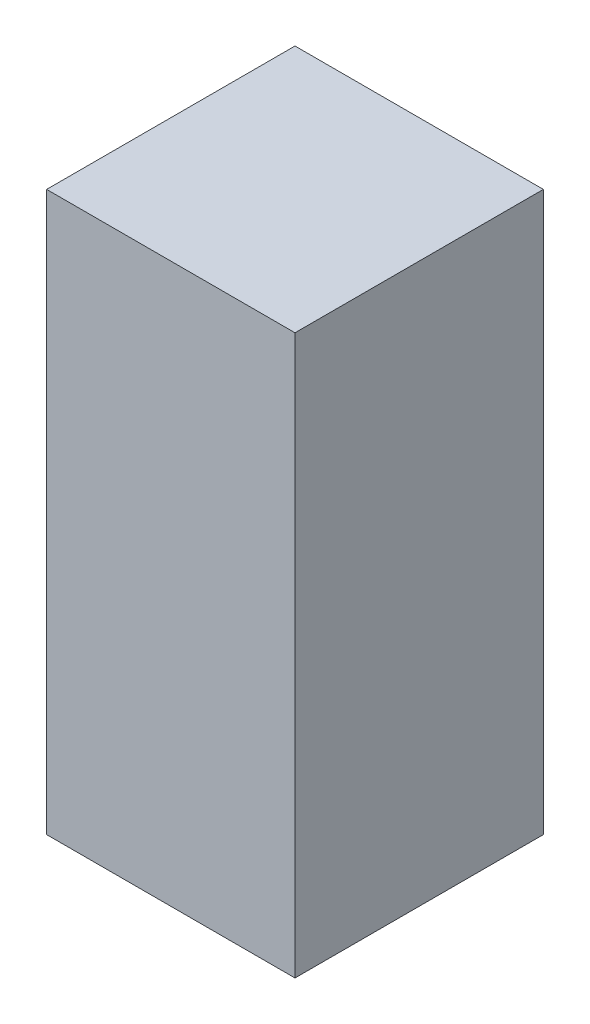
ISO-10303-21;
HEADER;
FILE_DESCRIPTION(('STEP AP214'),'2;1');
FILE_NAME('part.step','',(''),(''),'','','');
FILE_SCHEMA(('AUTOMOTIVE_DESIGN { 1 0 10303 214 1 1 1 1 }'));
ENDSEC;
DATA;
#1=APPLICATION_CONTEXT('core data for automotive mechanical design processes');
#2=APPLICATION_PROTOCOL_DEFINITION('international standard','automotive_design',2000,#1);
#3=PRODUCT_CONTEXT('',#1,'mechanical');
#4=PRODUCT('Part','Part','',(#3));
#5=PRODUCT_RELATED_PRODUCT_CATEGORY('part','',(#4));
#6=PRODUCT_DEFINITION_FORMATION('','',#4);
#7=PRODUCT_DEFINITION_CONTEXT('part definition',#1,'design');
#8=PRODUCT_DEFINITION('design','',#6,#7);
#9=PRODUCT_DEFINITION_SHAPE('','',#8);
#10=(LENGTH_UNIT() NAMED_UNIT(*) SI_UNIT(.MILLI.,.METRE.));
#11=(NAMED_UNIT(*) PLANE_ANGLE_UNIT() SI_UNIT($,.RADIAN.));
#12=(NAMED_UNIT(*) SI_UNIT($,.STERADIAN.) SOLID_ANGLE_UNIT());
#13=UNCERTAINTY_MEASURE_WITH_UNIT(LENGTH_MEASURE(1.E-05),#10,'distance_accuracy_value','');
#14=(GEOMETRIC_REPRESENTATION_CONTEXT(3) GLOBAL_UNCERTAINTY_ASSIGNED_CONTEXT((#13)) GLOBAL_UNIT_ASSIGNED_CONTEXT((#10,
#11,#12)) REPRESENTATION_CONTEXT('',''));
#15=CARTESIAN_POINT('',(0.,0.,0.));
#16=DIRECTION('',(0.,0.,1.));
#17=DIRECTION('',(1.,0.,0.));
#18=AXIS2_PLACEMENT_3D('',#15,#16,#17);
#19=CARTESIAN_POINT('',(177.5,552.,-247.5));
#20=DIRECTION('',(-1.,0.,0.));
#21=DIRECTION('',(0.,0.,1.));
#22=AXIS2_PLACEMENT_3D('',#19,#20,#21);
#23=PLANE('',#22);
#24=DIRECTION('',(0.,-1.,0.));
#25=VECTOR('',#24,1.);
#26=CARTESIAN_POINT('',(177.5,552.,-227.5));
#27=LINE('',#26,#25);
#28=CARTESIAN_POINT('',(177.5,597.,-227.5));
#29=VERTEX_POINT('',#28);
#30=CARTESIAN_POINT('',(177.5,552.,-227.5));
#31=VERTEX_POINT('',#30);
#32=EDGE_CURVE('E103',#29,#31,#27,.T.);
#33=ORIENTED_EDGE('',*,*,#32,.F.);
#34=DIRECTION('',(0.,0.,1.));
#35=VECTOR('',#34,1.);
#36=CARTESIAN_POINT('',(177.5,597.,-247.5));
#37=LINE('',#36,#35);
#38=CARTESIAN_POINT('',(177.5,597.,-247.5));
#39=VERTEX_POINT('',#38);
#40=EDGE_CURVE('E11',#39,#29,#37,.T.);
#41=ORIENTED_EDGE('',*,*,#40,.F.);
#42=DIRECTION('',(0.,-1.,0.));
#43=VECTOR('',#42,1.);
#44=CARTESIAN_POINT('',(177.5,552.,-247.5));
#45=LINE('',#44,#43);
#46=CARTESIAN_POINT('',(177.5,552.,-247.5));
#47=VERTEX_POINT('',#46);
#48=EDGE_CURVE('E97',#39,#47,#45,.T.);
#49=ORIENTED_EDGE('',*,*,#48,.T.);
#50=DIRECTION('',(0.,0.,1.));
#51=VECTOR('',#50,1.);
#52=CARTESIAN_POINT('',(177.5,552.,-247.5));
#53=LINE('',#52,#51);
#54=EDGE_CURVE('E42',#47,#31,#53,.T.);
#55=ORIENTED_EDGE('',*,*,#54,.T.);
#56=EDGE_LOOP('',(#33,#41,#49,#55));
#57=FACE_BOUND('',#56,.T.);
#58=ADVANCED_FACE('F39',(#57),#23,.T.);
#59=CARTESIAN_POINT('',(177.5,597.,-247.5));
#60=DIRECTION('',(0.,1.,0.));
#61=DIRECTION('',(0.,0.,1.));
#62=AXIS2_PLACEMENT_3D('',#59,#60,#61);
#63=PLANE('',#62);
#64=DIRECTION('',(-1.,0.,0.));
#65=VECTOR('',#64,1.);
#66=CARTESIAN_POINT('',(177.5,597.,-227.5));
#67=LINE('',#66,#65);
#68=CARTESIAN_POINT('',(197.5,597.,-227.5));
#69=VERTEX_POINT('',#68);
#70=EDGE_CURVE('E99',#69,#29,#67,.T.);
#71=ORIENTED_EDGE('',*,*,#70,.F.);
#72=DIRECTION('',(0.,0.,1.));
#73=VECTOR('',#72,1.);
#74=CARTESIAN_POINT('',(197.5,597.,-247.5));
#75=LINE('',#74,#73);
#76=CARTESIAN_POINT('',(197.5,597.,-247.5));
#77=VERTEX_POINT('',#76);
#78=EDGE_CURVE('E48',#77,#69,#75,.T.);
#79=ORIENTED_EDGE('',*,*,#78,.F.);
#80=DIRECTION('',(-1.,0.,0.));
#81=VECTOR('',#80,1.);
#82=CARTESIAN_POINT('',(177.5,597.,-247.5));
#83=LINE('',#82,#81);
#84=EDGE_CURVE('E94',#77,#39,#83,.T.);
#85=ORIENTED_EDGE('',*,*,#84,.T.);
#86=ORIENTED_EDGE('',*,*,#40,.T.);
#87=EDGE_LOOP('',(#71,#79,#85,#86));
#88=FACE_BOUND('',#87,.T.);
#89=ADVANCED_FACE('F113',(#88),#63,.T.);
#90=CARTESIAN_POINT('',(197.5,552.,-247.5));
#91=DIRECTION('',(1.,0.,0.));
#92=DIRECTION('',(0.,0.,-1.));
#93=AXIS2_PLACEMENT_3D('',#90,#91,#92);
#94=PLANE('',#93);
#95=DIRECTION('',(0.,1.,0.));
#96=VECTOR('',#95,1.);
#97=CARTESIAN_POINT('',(197.5,552.,-227.5));
#98=LINE('',#97,#96);
#99=CARTESIAN_POINT('',(197.5,552.,-227.5));
#100=VERTEX_POINT('',#99);
#101=EDGE_CURVE('E89',#100,#69,#98,.T.);
#102=ORIENTED_EDGE('',*,*,#101,.F.);
#103=DIRECTION('',(0.,0.,1.));
#104=VECTOR('',#103,1.);
#105=CARTESIAN_POINT('',(197.5,552.,-247.5));
#106=LINE('',#105,#104);
#107=CARTESIAN_POINT('',(197.5,552.,-247.5));
#108=VERTEX_POINT('',#107);
#109=EDGE_CURVE('E84',#108,#100,#106,.T.);
#110=ORIENTED_EDGE('',*,*,#109,.F.);
#111=DIRECTION('',(0.,1.,0.));
#112=VECTOR('',#111,1.);
#113=CARTESIAN_POINT('',(197.5,552.,-247.5));
#114=LINE('',#113,#112);
#115=EDGE_CURVE('E87',#108,#77,#114,.T.);
#116=ORIENTED_EDGE('',*,*,#115,.T.);
#117=ORIENTED_EDGE('',*,*,#78,.T.);
#118=EDGE_LOOP('',(#102,#110,#116,#117));
#119=FACE_BOUND('',#118,.T.);
#120=ADVANCED_FACE('F86',(#119),#94,.T.);
#121=CARTESIAN_POINT('',(177.5,552.,-247.5));
#122=DIRECTION('',(0.,-1.,0.));
#123=DIRECTION('',(0.,0.,-1.));
#124=AXIS2_PLACEMENT_3D('',#121,#122,#123);
#125=PLANE('',#124);
#126=DIRECTION('',(1.,0.,0.));
#127=VECTOR('',#126,1.);
#128=CARTESIAN_POINT('',(177.5,552.,-227.5));
#129=LINE('',#128,#127);
#130=EDGE_CURVE('E106',#31,#100,#129,.T.);
#131=ORIENTED_EDGE('',*,*,#130,.F.);
#132=ORIENTED_EDGE('',*,*,#54,.F.);
#133=DIRECTION('',(1.,0.,0.));
#134=VECTOR('',#133,1.);
#135=CARTESIAN_POINT('',(177.5,552.,-247.5));
#136=LINE('',#135,#134);
#137=EDGE_CURVE('E93',#47,#108,#136,.T.);
#138=ORIENTED_EDGE('',*,*,#137,.T.);
#139=ORIENTED_EDGE('',*,*,#109,.T.);
#140=EDGE_LOOP('',(#131,#132,#138,#139));
#141=FACE_BOUND('',#140,.T.);
#142=ADVANCED_FACE('F96',(#141),#125,.T.);
#143=CARTESIAN_POINT('',(0.,0.,-247.5));
#144=DIRECTION('',(0.,0.,-1.));
#145=DIRECTION('',(-1.,0.,0.));
#146=AXIS2_PLACEMENT_3D('',#143,#144,#145);
#147=PLANE('',#146);
#148=ORIENTED_EDGE('',*,*,#48,.F.);
#149=ORIENTED_EDGE('',*,*,#84,.F.);
#150=ORIENTED_EDGE('',*,*,#115,.F.);
#151=ORIENTED_EDGE('',*,*,#137,.F.);
#152=EDGE_LOOP('',(#148,#149,#150,#151));
#153=FACE_BOUND('',#152,.T.);
#154=ADVANCED_FACE('F92',(#153),#147,.T.);
#155=CARTESIAN_POINT('',(0.,0.,-227.5));
#156=DIRECTION('',(0.,0.,-1.));
#157=DIRECTION('',(-1.,0.,0.));
#158=AXIS2_PLACEMENT_3D('',#155,#156,#157);
#159=PLANE('',#158);
#160=ORIENTED_EDGE('',*,*,#32,.T.);
#161=ORIENTED_EDGE('',*,*,#130,.T.);
#162=ORIENTED_EDGE('',*,*,#101,.T.);
#163=ORIENTED_EDGE('',*,*,#70,.T.);
#164=EDGE_LOOP('',(#160,#161,#162,#163));
#165=FACE_BOUND('',#164,.T.);
#166=ADVANCED_FACE('F112',(#165),#159,.F.);
#167=CLOSED_SHELL('',(#58,#89,#120,#142,#154,#166));
#168=MANIFOLD_SOLID_BREP('B2',#167);
#169=ADVANCED_BREP_SHAPE_REPRESENTATION('',(#18,#168),#14);
#170=SHAPE_DEFINITION_REPRESENTATION(#9,#169);
ENDSEC;
END-ISO-10303-21;
